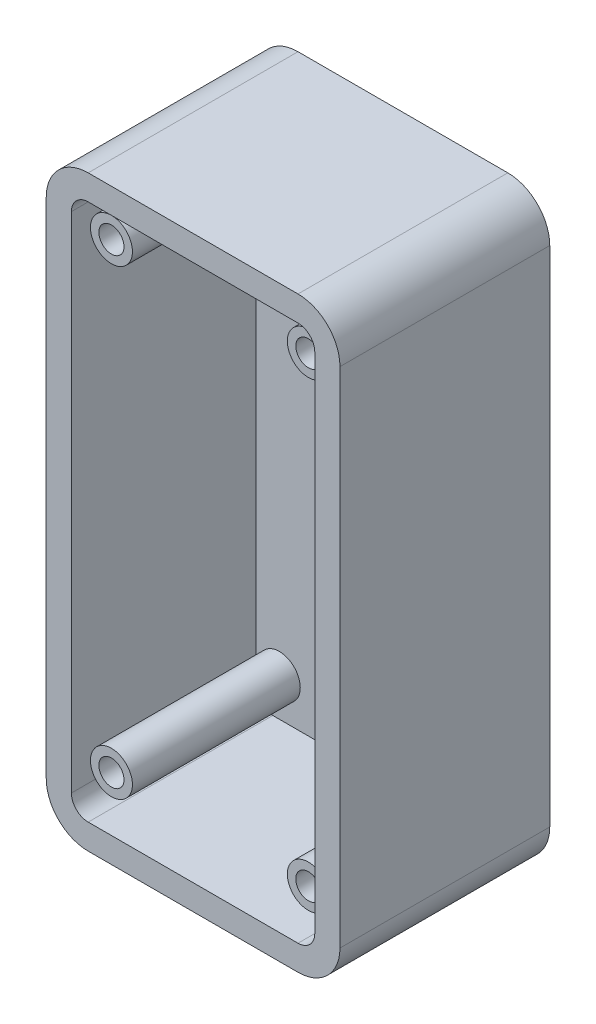
ISO-10303-21;
HEADER;
FILE_DESCRIPTION(('STEP AP214'),'2;1');
FILE_NAME('part.step','',(''),(''),'','','');
FILE_SCHEMA(('AUTOMOTIVE_DESIGN { 1 0 10303 214 1 1 1 1 }'));
ENDSEC;
DATA;
#1=APPLICATION_CONTEXT('core data for automotive mechanical design processes');
#2=APPLICATION_PROTOCOL_DEFINITION('international standard','automotive_design',2000,#1);
#3=PRODUCT_CONTEXT('',#1,'mechanical');
#4=PRODUCT('Part','Part','',(#3));
#5=PRODUCT_RELATED_PRODUCT_CATEGORY('part','',(#4));
#6=PRODUCT_DEFINITION_FORMATION('','',#4);
#7=PRODUCT_DEFINITION_CONTEXT('part definition',#1,'design');
#8=PRODUCT_DEFINITION('design','',#6,#7);
#9=PRODUCT_DEFINITION_SHAPE('','',#8);
#10=(LENGTH_UNIT() NAMED_UNIT(*) SI_UNIT(.MILLI.,.METRE.));
#11=(NAMED_UNIT(*) PLANE_ANGLE_UNIT() SI_UNIT($,.RADIAN.));
#12=(NAMED_UNIT(*) SI_UNIT($,.STERADIAN.) SOLID_ANGLE_UNIT());
#13=UNCERTAINTY_MEASURE_WITH_UNIT(LENGTH_MEASURE(1.E-05),#10,'distance_accuracy_value','');
#14=(GEOMETRIC_REPRESENTATION_CONTEXT(3) GLOBAL_UNCERTAINTY_ASSIGNED_CONTEXT((#13)) GLOBAL_UNIT_ASSIGNED_CONTEXT((#10,
#11,#12)) REPRESENTATION_CONTEXT('',''));
#15=CARTESIAN_POINT('',(0.,0.,0.));
#16=DIRECTION('',(0.,0.,1.));
#17=DIRECTION('',(1.,0.,0.));
#18=AXIS2_PLACEMENT_3D('',#15,#16,#17);
#19=CARTESIAN_POINT('',(-193.425196850394,5.,25.));
#20=DIRECTION('',(0.,0.,-1.));
#21=DIRECTION('',(-1.,0.,0.));
#22=AXIS2_PLACEMENT_3D('',#19,#20,#21);
#23=CYLINDRICAL_SURFACE('',#22,5.);
#24=CARTESIAN_POINT('',(-193.425196850394,5.,0.));
#25=DIRECTION('',(0.,0.,1.));
#26=DIRECTION('',(1.,0.,0.));
#27=AXIS2_PLACEMENT_3D('',#24,#25,#26);
#28=CIRCLE('',#27,5.);
#29=CARTESIAN_POINT('',(-198.425196850394,5.00000000000004,0.));
#30=VERTEX_POINT('',#29);
#31=CARTESIAN_POINT('',(-193.425196850394,0.,0.));
#32=VERTEX_POINT('',#31);
#33=EDGE_CURVE('E142',#30,#32,#28,.T.);
#34=ORIENTED_EDGE('',*,*,#33,.T.);
#35=DIRECTION('',(0.,0.,-1.));
#36=VECTOR('',#35,1.);
#37=CARTESIAN_POINT('',(-193.425196850394,0.,25.));
#38=LINE('',#37,#36);
#39=CARTESIAN_POINT('',(-193.425196850394,0.,25.));
#40=VERTEX_POINT('',#39);
#41=EDGE_CURVE('E11',#40,#32,#38,.T.);
#42=ORIENTED_EDGE('',*,*,#41,.F.);
#43=CARTESIAN_POINT('',(-193.425196850394,5.,25.));
#44=DIRECTION('',(0.,0.,1.));
#45=DIRECTION('',(1.,0.,0.));
#46=AXIS2_PLACEMENT_3D('',#43,#44,#45);
#47=CIRCLE('',#46,5.);
#48=CARTESIAN_POINT('',(-198.425196850394,5.00000000000004,25.));
#49=VERTEX_POINT('',#48);
#50=EDGE_CURVE('E158',#49,#40,#47,.T.);
#51=ORIENTED_EDGE('',*,*,#50,.F.);
#52=DIRECTION('',(0.,0.,-1.));
#53=VECTOR('',#52,1.);
#54=CARTESIAN_POINT('',(-198.425196850394,5.00000000000004,25.));
#55=LINE('',#54,#53);
#56=EDGE_CURVE('E138',#49,#30,#55,.T.);
#57=ORIENTED_EDGE('',*,*,#56,.T.);
#58=EDGE_LOOP('',(#34,#42,#51,#57));
#59=FACE_BOUND('',#58,.T.);
#60=ADVANCED_FACE('F33',(#59),#23,.T.);
#61=CARTESIAN_POINT('',(-193.425196850394,0.,25.));
#62=DIRECTION('',(0.,1.,0.));
#63=DIRECTION('',(0.,0.,1.));
#64=AXIS2_PLACEMENT_3D('',#61,#62,#63);
#65=PLANE('',#64);
#66=DIRECTION('',(1.,0.,0.));
#67=VECTOR('',#66,1.);
#68=CARTESIAN_POINT('',(-193.425196850394,0.,0.));
#69=LINE('',#68,#67);
#70=CARTESIAN_POINT('',(-168.425196850394,0.,0.));
#71=VERTEX_POINT('',#70);
#72=EDGE_CURVE('E145',#32,#71,#69,.T.);
#73=ORIENTED_EDGE('',*,*,#72,.T.);
#74=DIRECTION('',(0.,0.,-1.));
#75=VECTOR('',#74,1.);
#76=CARTESIAN_POINT('',(-168.425196850394,0.,25.));
#77=LINE('',#76,#75);
#78=CARTESIAN_POINT('',(-168.425196850394,0.,25.));
#79=VERTEX_POINT('',#78);
#80=EDGE_CURVE('E41',#79,#71,#77,.T.);
#81=ORIENTED_EDGE('',*,*,#80,.F.);
#82=DIRECTION('',(1.,0.,0.));
#83=VECTOR('',#82,1.);
#84=CARTESIAN_POINT('',(-193.425196850394,0.,25.));
#85=LINE('',#84,#83);
#86=EDGE_CURVE('E99',#40,#79,#85,.T.);
#87=ORIENTED_EDGE('',*,*,#86,.F.);
#88=ORIENTED_EDGE('',*,*,#41,.T.);
#89=EDGE_LOOP('',(#73,#81,#87,#88));
#90=FACE_BOUND('',#89,.T.);
#91=ADVANCED_FACE('F300',(#90),#65,.F.);
#92=CARTESIAN_POINT('',(-168.425196850394,5.,25.));
#93=DIRECTION('',(0.,0.,-1.));
#94=DIRECTION('',(-1.,0.,0.));
#95=AXIS2_PLACEMENT_3D('',#92,#93,#94);
#96=CYLINDRICAL_SURFACE('',#95,5.);
#97=CARTESIAN_POINT('',(-168.425196850394,5.,0.));
#98=DIRECTION('',(0.,0.,1.));
#99=DIRECTION('',(1.,0.,0.));
#100=AXIS2_PLACEMENT_3D('',#97,#98,#99);
#101=CIRCLE('',#100,5.);
#102=CARTESIAN_POINT('',(-163.425196850394,5.00000000000004,0.));
#103=VERTEX_POINT('',#102);
#104=EDGE_CURVE('E148',#71,#103,#101,.T.);
#105=ORIENTED_EDGE('',*,*,#104,.T.);
#106=DIRECTION('',(0.,0.,-1.));
#107=VECTOR('',#106,1.);
#108=CARTESIAN_POINT('',(-163.425196850394,5.00000000000004,25.));
#109=LINE('',#108,#107);
#110=CARTESIAN_POINT('',(-163.425196850394,5.00000000000004,25.));
#111=VERTEX_POINT('',#110);
#112=EDGE_CURVE('E165',#111,#103,#109,.T.);
#113=ORIENTED_EDGE('',*,*,#112,.F.);
#114=CARTESIAN_POINT('',(-168.425196850394,5.,25.));
#115=DIRECTION('',(0.,0.,1.));
#116=DIRECTION('',(1.,0.,0.));
#117=AXIS2_PLACEMENT_3D('',#114,#115,#116);
#118=CIRCLE('',#117,5.);
#119=EDGE_CURVE('E280',#79,#111,#118,.T.);
#120=ORIENTED_EDGE('',*,*,#119,.F.);
#121=ORIENTED_EDGE('',*,*,#80,.T.);
#122=EDGE_LOOP('',(#105,#113,#120,#121));
#123=FACE_BOUND('',#122,.T.);
#124=ADVANCED_FACE('F303',(#123),#96,.T.);
#125=CARTESIAN_POINT('',(-163.425196850394,65.,25.));
#126=DIRECTION('',(-1.,0.,0.));
#127=DIRECTION('',(0.,-1.,0.));
#128=AXIS2_PLACEMENT_3D('',#125,#126,#127);
#129=PLANE('',#128);
#130=DIRECTION('',(0.,1.,0.));
#131=VECTOR('',#130,1.);
#132=CARTESIAN_POINT('',(-163.425196850394,65.,0.));
#133=LINE('',#132,#131);
#134=CARTESIAN_POINT('',(-163.425196850394,65.,0.));
#135=VERTEX_POINT('',#134);
#136=EDGE_CURVE('E150',#103,#135,#133,.T.);
#137=ORIENTED_EDGE('',*,*,#136,.T.);
#138=DIRECTION('',(0.,0.,-1.));
#139=VECTOR('',#138,1.);
#140=CARTESIAN_POINT('',(-163.425196850394,65.,25.));
#141=LINE('',#140,#139);
#142=CARTESIAN_POINT('',(-163.425196850394,65.,25.));
#143=VERTEX_POINT('',#142);
#144=EDGE_CURVE('E162',#143,#135,#141,.T.);
#145=ORIENTED_EDGE('',*,*,#144,.F.);
#146=DIRECTION('',(0.,1.,0.));
#147=VECTOR('',#146,1.);
#148=CARTESIAN_POINT('',(-163.425196850394,65.,25.));
#149=LINE('',#148,#147);
#150=EDGE_CURVE('E282',#111,#143,#149,.T.);
#151=ORIENTED_EDGE('',*,*,#150,.F.);
#152=ORIENTED_EDGE('',*,*,#112,.T.);
#153=EDGE_LOOP('',(#137,#145,#151,#152));
#154=FACE_BOUND('',#153,.T.);
#155=ADVANCED_FACE('F288',(#154),#129,.F.);
#156=CARTESIAN_POINT('',(-168.425196850394,65.,25.));
#157=DIRECTION('',(0.,0.,-1.));
#158=DIRECTION('',(-1.,0.,0.));
#159=AXIS2_PLACEMENT_3D('',#156,#157,#158);
#160=CYLINDRICAL_SURFACE('',#159,5.);
#161=CARTESIAN_POINT('',(-168.425196850394,65.,0.));
#162=DIRECTION('',(0.,0.,1.));
#163=DIRECTION('',(-1.,0.,0.));
#164=AXIS2_PLACEMENT_3D('',#161,#162,#163);
#165=CIRCLE('',#164,5.);
#166=CARTESIAN_POINT('',(-168.425196850394,70.,0.));
#167=VERTEX_POINT('',#166);
#168=EDGE_CURVE('E152',#135,#167,#165,.T.);
#169=ORIENTED_EDGE('',*,*,#168,.T.);
#170=DIRECTION('',(0.,0.,-1.));
#171=VECTOR('',#170,1.);
#172=CARTESIAN_POINT('',(-168.425196850394,70.,25.));
#173=LINE('',#172,#171);
#174=CARTESIAN_POINT('',(-168.425196850394,70.,25.));
#175=VERTEX_POINT('',#174);
#176=EDGE_CURVE('E133',#175,#167,#173,.T.);
#177=ORIENTED_EDGE('',*,*,#176,.F.);
#178=CARTESIAN_POINT('',(-168.425196850394,65.,25.));
#179=DIRECTION('',(0.,0.,1.));
#180=DIRECTION('',(-1.,0.,0.));
#181=AXIS2_PLACEMENT_3D('',#178,#179,#180);
#182=CIRCLE('',#181,5.);
#183=EDGE_CURVE('E121',#143,#175,#182,.T.);
#184=ORIENTED_EDGE('',*,*,#183,.F.);
#185=ORIENTED_EDGE('',*,*,#144,.T.);
#186=EDGE_LOOP('',(#169,#177,#184,#185));
#187=FACE_BOUND('',#186,.T.);
#188=ADVANCED_FACE('F292',(#187),#160,.T.);
#189=CARTESIAN_POINT('',(-193.425196850394,70.,25.));
#190=DIRECTION('',(0.,-1.,0.));
#191=DIRECTION('',(0.,0.,-1.));
#192=AXIS2_PLACEMENT_3D('',#189,#190,#191);
#193=PLANE('',#192);
#194=DIRECTION('',(-1.,0.,0.));
#195=VECTOR('',#194,1.);
#196=CARTESIAN_POINT('',(-193.425196850394,70.,0.));
#197=LINE('',#196,#195);
#198=CARTESIAN_POINT('',(-193.425196850394,70.,0.));
#199=VERTEX_POINT('',#198);
#200=EDGE_CURVE('E130',#167,#199,#197,.T.);
#201=ORIENTED_EDGE('',*,*,#200,.T.);
#202=DIRECTION('',(0.,0.,-1.));
#203=VECTOR('',#202,1.);
#204=CARTESIAN_POINT('',(-193.425196850394,70.,25.));
#205=LINE('',#204,#203);
#206=CARTESIAN_POINT('',(-193.425196850394,70.,25.));
#207=VERTEX_POINT('',#206);
#208=EDGE_CURVE('E127',#207,#199,#205,.T.);
#209=ORIENTED_EDGE('',*,*,#208,.F.);
#210=DIRECTION('',(-1.,0.,0.));
#211=VECTOR('',#210,1.);
#212=CARTESIAN_POINT('',(-193.425196850394,70.,25.));
#213=LINE('',#212,#211);
#214=EDGE_CURVE('E114',#175,#207,#213,.T.);
#215=ORIENTED_EDGE('',*,*,#214,.F.);
#216=ORIENTED_EDGE('',*,*,#176,.T.);
#217=EDGE_LOOP('',(#201,#209,#215,#216));
#218=FACE_BOUND('',#217,.T.);
#219=ADVANCED_FACE('F128',(#218),#193,.F.);
#220=CARTESIAN_POINT('',(-193.425196850394,65.,25.));
#221=DIRECTION('',(0.,0.,-1.));
#222=DIRECTION('',(-1.,0.,0.));
#223=AXIS2_PLACEMENT_3D('',#220,#221,#222);
#224=CYLINDRICAL_SURFACE('',#223,5.);
#225=CARTESIAN_POINT('',(-193.425196850394,65.,0.));
#226=DIRECTION('',(0.,0.,1.));
#227=DIRECTION('',(1.,0.,0.));
#228=AXIS2_PLACEMENT_3D('',#225,#226,#227);
#229=CIRCLE('',#228,5.);
#230=CARTESIAN_POINT('',(-198.425196850394,65.,0.));
#231=VERTEX_POINT('',#230);
#232=EDGE_CURVE('E155',#199,#231,#229,.T.);
#233=ORIENTED_EDGE('',*,*,#232,.T.);
#234=DIRECTION('',(0.,0.,-1.));
#235=VECTOR('',#234,1.);
#236=CARTESIAN_POINT('',(-198.425196850394,65.,25.));
#237=LINE('',#236,#235);
#238=CARTESIAN_POINT('',(-198.425196850394,65.,25.));
#239=VERTEX_POINT('',#238);
#240=EDGE_CURVE('E134',#239,#231,#237,.T.);
#241=ORIENTED_EDGE('',*,*,#240,.F.);
#242=CARTESIAN_POINT('',(-193.425196850394,65.,25.));
#243=DIRECTION('',(0.,0.,1.));
#244=DIRECTION('',(1.,0.,0.));
#245=AXIS2_PLACEMENT_3D('',#242,#243,#244);
#246=CIRCLE('',#245,5.);
#247=EDGE_CURVE('E118',#207,#239,#246,.T.);
#248=ORIENTED_EDGE('',*,*,#247,.F.);
#249=ORIENTED_EDGE('',*,*,#208,.T.);
#250=EDGE_LOOP('',(#233,#241,#248,#249));
#251=FACE_BOUND('',#250,.T.);
#252=ADVANCED_FACE('F136',(#251),#224,.T.);
#253=CARTESIAN_POINT('',(-198.425196850394,65.,25.));
#254=DIRECTION('',(1.,0.,0.));
#255=DIRECTION('',(0.,0.,-1.));
#256=AXIS2_PLACEMENT_3D('',#253,#254,#255);
#257=PLANE('',#256);
#258=DIRECTION('',(0.,-1.,0.));
#259=VECTOR('',#258,1.);
#260=CARTESIAN_POINT('',(-198.425196850394,65.,0.));
#261=LINE('',#260,#259);
#262=EDGE_CURVE('E91',#231,#30,#261,.T.);
#263=ORIENTED_EDGE('',*,*,#262,.T.);
#264=ORIENTED_EDGE('',*,*,#56,.F.);
#265=DIRECTION('',(0.,-1.,0.));
#266=VECTOR('',#265,1.);
#267=CARTESIAN_POINT('',(-198.425196850394,65.,25.));
#268=LINE('',#267,#266);
#269=EDGE_CURVE('E58',#239,#49,#268,.T.);
#270=ORIENTED_EDGE('',*,*,#269,.F.);
#271=ORIENTED_EDGE('',*,*,#240,.T.);
#272=EDGE_LOOP('',(#263,#264,#270,#271));
#273=FACE_BOUND('',#272,.T.);
#274=ADVANCED_FACE('F296',(#273),#257,.F.);
#275=CARTESIAN_POINT('',(-193.425196850394,5.,25.));
#276=DIRECTION('',(0.,0.,1.));
#277=DIRECTION('',(1.,0.,0.));
#278=AXIS2_PLACEMENT_3D('',#275,#276,#277);
#279=PLANE('',#278);
#280=CARTESIAN_POINT('',(-193.425196850394,5.,25.));
#281=DIRECTION('',(0.,0.,1.));
#282=DIRECTION('',(1.,0.,0.));
#283=AXIS2_PLACEMENT_3D('',#280,#281,#282);
#284=CIRCLE('',#283,2.);
#285=CARTESIAN_POINT('',(-195.425196850394,5.00000000000003,25.));
#286=VERTEX_POINT('',#285);
#287=CARTESIAN_POINT('',(-193.425196850394,3.,25.));
#288=VERTEX_POINT('',#287);
#289=EDGE_CURVE('E257',#286,#288,#284,.T.);
#290=ORIENTED_EDGE('',*,*,#289,.F.);
#291=DIRECTION('',(0.,-1.,0.));
#292=VECTOR('',#291,1.);
#293=CARTESIAN_POINT('',(-195.425196850394,65.,25.));
#294=LINE('',#293,#292);
#295=CARTESIAN_POINT('',(-195.425196850394,65.,25.));
#296=VERTEX_POINT('',#295);
#297=EDGE_CURVE('E221',#296,#286,#294,.T.);
#298=ORIENTED_EDGE('',*,*,#297,.F.);
#299=CARTESIAN_POINT('',(-193.425196850394,65.,25.));
#300=DIRECTION('',(0.,0.,1.));
#301=DIRECTION('',(1.,0.,0.));
#302=AXIS2_PLACEMENT_3D('',#299,#300,#301);
#303=CIRCLE('',#302,2.);
#304=CARTESIAN_POINT('',(-193.425196850394,67.,25.));
#305=VERTEX_POINT('',#304);
#306=EDGE_CURVE('E275',#305,#296,#303,.T.);
#307=ORIENTED_EDGE('',*,*,#306,.F.);
#308=DIRECTION('',(-1.,0.,0.));
#309=VECTOR('',#308,1.);
#310=CARTESIAN_POINT('',(-193.425196850394,67.,25.));
#311=LINE('',#310,#309);
#312=CARTESIAN_POINT('',(-168.425196850394,67.,25.));
#313=VERTEX_POINT('',#312);
#314=EDGE_CURVE('E272',#313,#305,#311,.T.);
#315=ORIENTED_EDGE('',*,*,#314,.F.);
#316=CARTESIAN_POINT('',(-168.425196850394,65.,25.));
#317=DIRECTION('',(0.,0.,1.));
#318=DIRECTION('',(1.,0.,0.));
#319=AXIS2_PLACEMENT_3D('',#316,#317,#318);
#320=CIRCLE('',#319,2.);
#321=CARTESIAN_POINT('',(-166.425196850394,65.,25.));
#322=VERTEX_POINT('',#321);
#323=EDGE_CURVE('E269',#322,#313,#320,.T.);
#324=ORIENTED_EDGE('',*,*,#323,.F.);
#325=DIRECTION('',(0.,1.,0.));
#326=VECTOR('',#325,1.);
#327=CARTESIAN_POINT('',(-166.425196850394,65.,25.));
#328=LINE('',#327,#326);
#329=CARTESIAN_POINT('',(-166.425196850394,5.00000000000001,25.));
#330=VERTEX_POINT('',#329);
#331=EDGE_CURVE('E266',#330,#322,#328,.T.);
#332=ORIENTED_EDGE('',*,*,#331,.F.);
#333=CARTESIAN_POINT('',(-168.425196850394,5.,25.));
#334=DIRECTION('',(0.,0.,1.));
#335=DIRECTION('',(1.,0.,0.));
#336=AXIS2_PLACEMENT_3D('',#333,#334,#335);
#337=CIRCLE('',#336,2.);
#338=CARTESIAN_POINT('',(-168.425196850394,3.,25.));
#339=VERTEX_POINT('',#338);
#340=EDGE_CURVE('E263',#339,#330,#337,.T.);
#341=ORIENTED_EDGE('',*,*,#340,.F.);
#342=DIRECTION('',(1.,0.,0.));
#343=VECTOR('',#342,1.);
#344=CARTESIAN_POINT('',(-193.425196850394,3.,25.));
#345=LINE('',#344,#343);
#346=EDGE_CURVE('E260',#288,#339,#345,.T.);
#347=ORIENTED_EDGE('',*,*,#346,.F.);
#348=EDGE_LOOP('',(#290,#298,#307,#315,#324,#332,#341,#347));
#349=FACE_BOUND('',#348,.T.);
#350=ORIENTED_EDGE('',*,*,#50,.T.);
#351=ORIENTED_EDGE('',*,*,#86,.T.);
#352=ORIENTED_EDGE('',*,*,#119,.T.);
#353=ORIENTED_EDGE('',*,*,#150,.T.);
#354=ORIENTED_EDGE('',*,*,#183,.T.);
#355=ORIENTED_EDGE('',*,*,#214,.T.);
#356=ORIENTED_EDGE('',*,*,#247,.T.);
#357=ORIENTED_EDGE('',*,*,#269,.T.);
#358=EDGE_LOOP('',(#350,#351,#352,#353,#354,#355,#356,#357));
#359=FACE_BOUND('',#358,.T.);
#360=ADVANCED_FACE('F116',(#349,#359),#279,.T.);
#361=CARTESIAN_POINT('',(-193.425196850394,5.,0.));
#362=DIRECTION('',(0.,0.,1.));
#363=DIRECTION('',(1.,0.,0.));
#364=AXIS2_PLACEMENT_3D('',#361,#362,#363);
#365=PLANE('',#364);
#366=CARTESIAN_POINT('',(-192.65673945571,7.5,0.));
#367=DIRECTION('',(0.,0.,1.));
#368=DIRECTION('',(1.,0.,0.));
#369=AXIS2_PLACEMENT_3D('',#366,#367,#368);
#370=CIRCLE('',#369,1.5);
#371=CARTESIAN_POINT('',(-191.15673945571,7.5,0.));
#372=VERTEX_POINT('',#371);
#373=EDGE_CURVE('E598',#372,#372,#370,.T.);
#374=ORIENTED_EDGE('',*,*,#373,.T.);
#375=EDGE_LOOP('',(#374));
#376=FACE_BOUND('',#375,.T.);
#377=CARTESIAN_POINT('',(-169.193654245077,7.5,0.));
#378=DIRECTION('',(0.,0.,1.));
#379=DIRECTION('',(1.,0.,0.));
#380=AXIS2_PLACEMENT_3D('',#377,#378,#379);
#381=CIRCLE('',#380,1.5);
#382=CARTESIAN_POINT('',(-167.693654245077,7.5,0.));
#383=VERTEX_POINT('',#382);
#384=EDGE_CURVE('E595',#383,#383,#381,.T.);
#385=ORIENTED_EDGE('',*,*,#384,.T.);
#386=EDGE_LOOP('',(#385));
#387=FACE_BOUND('',#386,.T.);
#388=CARTESIAN_POINT('',(-169.193654245077,62.5,0.));
#389=DIRECTION('',(0.,0.,1.));
#390=DIRECTION('',(1.,0.,0.));
#391=AXIS2_PLACEMENT_3D('',#388,#389,#390);
#392=CIRCLE('',#391,1.5);
#393=CARTESIAN_POINT('',(-167.693654245077,62.5,0.));
#394=VERTEX_POINT('',#393);
#395=EDGE_CURVE('E593',#394,#394,#392,.T.);
#396=ORIENTED_EDGE('',*,*,#395,.T.);
#397=EDGE_LOOP('',(#396));
#398=FACE_BOUND('',#397,.T.);
#399=CARTESIAN_POINT('',(-192.65673945571,62.5,0.));
#400=DIRECTION('',(0.,0.,1.));
#401=DIRECTION('',(1.,0.,0.));
#402=AXIS2_PLACEMENT_3D('',#399,#400,#401);
#403=CIRCLE('',#402,1.5);
#404=CARTESIAN_POINT('',(-191.15673945571,62.5,0.));
#405=VERTEX_POINT('',#404);
#406=EDGE_CURVE('E174',#405,#405,#403,.T.);
#407=ORIENTED_EDGE('',*,*,#406,.T.);
#408=EDGE_LOOP('',(#407));
#409=FACE_BOUND('',#408,.T.);
#410=ORIENTED_EDGE('',*,*,#33,.F.);
#411=ORIENTED_EDGE('',*,*,#262,.F.);
#412=ORIENTED_EDGE('',*,*,#232,.F.);
#413=ORIENTED_EDGE('',*,*,#200,.F.);
#414=ORIENTED_EDGE('',*,*,#168,.F.);
#415=ORIENTED_EDGE('',*,*,#136,.F.);
#416=ORIENTED_EDGE('',*,*,#104,.F.);
#417=ORIENTED_EDGE('',*,*,#72,.F.);
#418=EDGE_LOOP('',(#410,#411,#412,#413,#414,#415,#416,#417));
#419=FACE_BOUND('',#418,.T.);
#420=ADVANCED_FACE('F295',(#376,#387,#398,#409,#419),#365,.F.);
#421=CARTESIAN_POINT('',(-193.425196850394,5.,25.));
#422=DIRECTION('',(0.,0.,-1.));
#423=DIRECTION('',(-1.,0.,0.));
#424=AXIS2_PLACEMENT_3D('',#421,#422,#423);
#425=CYLINDRICAL_SURFACE('',#424,2.);
#426=CARTESIAN_POINT('',(-193.425196850394,5.,3.));
#427=DIRECTION('',(0.,0.,1.));
#428=DIRECTION('',(1.,0.,0.));
#429=AXIS2_PLACEMENT_3D('',#426,#427,#428);
#430=CIRCLE('',#429,2.);
#431=CARTESIAN_POINT('',(-195.425196850394,5.00000000000001,3.));
#432=VERTEX_POINT('',#431);
#433=CARTESIAN_POINT('',(-193.425196850394,3.,3.));
#434=VERTEX_POINT('',#433);
#435=EDGE_CURVE('E209',#432,#434,#430,.T.);
#436=ORIENTED_EDGE('',*,*,#435,.F.);
#437=DIRECTION('',(0.,0.,-1.));
#438=VECTOR('',#437,1.);
#439=CARTESIAN_POINT('',(-195.425196850394,5.00000000000001,25.));
#440=LINE('',#439,#438);
#441=EDGE_CURVE('E218',#286,#432,#440,.T.);
#442=ORIENTED_EDGE('',*,*,#441,.F.);
#443=ORIENTED_EDGE('',*,*,#289,.T.);
#444=DIRECTION('',(0.,0.,1.));
#445=VECTOR('',#444,1.);
#446=CARTESIAN_POINT('',(-193.425196850394,3.,25.));
#447=LINE('',#446,#445);
#448=EDGE_CURVE('E146',#288,#434,#447,.F.);
#449=ORIENTED_EDGE('',*,*,#448,.T.);
#450=EDGE_LOOP('',(#436,#442,#443,#449));
#451=FACE_BOUND('',#450,.T.);
#452=ADVANCED_FACE('F376',(#451),#425,.F.);
#453=CARTESIAN_POINT('',(-193.425196850394,3.,25.));
#454=DIRECTION('',(0.,1.,0.));
#455=DIRECTION('',(0.,0.,1.));
#456=AXIS2_PLACEMENT_3D('',#453,#454,#455);
#457=PLANE('',#456);
#458=DIRECTION('',(1.,0.,0.));
#459=VECTOR('',#458,1.);
#460=CARTESIAN_POINT('',(-193.425196850394,3.,3.));
#461=LINE('',#460,#459);
#462=CARTESIAN_POINT('',(-168.425196850394,3.,3.));
#463=VERTEX_POINT('',#462);
#464=EDGE_CURVE('E214',#434,#463,#461,.T.);
#465=ORIENTED_EDGE('',*,*,#464,.F.);
#466=ORIENTED_EDGE('',*,*,#448,.F.);
#467=ORIENTED_EDGE('',*,*,#346,.T.);
#468=DIRECTION('',(0.,0.,-1.));
#469=VECTOR('',#468,1.);
#470=CARTESIAN_POINT('',(-168.425196850394,3.,25.));
#471=LINE('',#470,#469);
#472=EDGE_CURVE('E217',#339,#463,#471,.T.);
#473=ORIENTED_EDGE('',*,*,#472,.T.);
#474=EDGE_LOOP('',(#465,#466,#467,#473));
#475=FACE_BOUND('',#474,.T.);
#476=ADVANCED_FACE('F381',(#475),#457,.T.);
#477=CARTESIAN_POINT('',(-168.425196850394,5.,25.));
#478=DIRECTION('',(0.,0.,-1.));
#479=DIRECTION('',(-1.,0.,0.));
#480=AXIS2_PLACEMENT_3D('',#477,#478,#479);
#481=CYLINDRICAL_SURFACE('',#480,2.);
#482=CARTESIAN_POINT('',(-168.425196850394,5.,3.));
#483=DIRECTION('',(0.,0.,1.));
#484=DIRECTION('',(1.,0.,0.));
#485=AXIS2_PLACEMENT_3D('',#482,#483,#484);
#486=CIRCLE('',#485,2.);
#487=CARTESIAN_POINT('',(-166.425196850394,5.00000000000003,3.));
#488=VERTEX_POINT('',#487);
#489=EDGE_CURVE('E224',#463,#488,#486,.T.);
#490=ORIENTED_EDGE('',*,*,#489,.F.);
#491=ORIENTED_EDGE('',*,*,#472,.F.);
#492=ORIENTED_EDGE('',*,*,#340,.T.);
#493=DIRECTION('',(0.,0.,1.));
#494=VECTOR('',#493,1.);
#495=CARTESIAN_POINT('',(-166.425196850394,5.00000000000003,25.));
#496=LINE('',#495,#494);
#497=EDGE_CURVE('E227',#330,#488,#496,.F.);
#498=ORIENTED_EDGE('',*,*,#497,.T.);
#499=EDGE_LOOP('',(#490,#491,#492,#498));
#500=FACE_BOUND('',#499,.T.);
#501=ADVANCED_FACE('F391',(#500),#481,.F.);
#502=CARTESIAN_POINT('',(-166.425196850394,65.,25.));
#503=DIRECTION('',(-1.,0.,0.));
#504=DIRECTION('',(0.,-1.,0.));
#505=AXIS2_PLACEMENT_3D('',#502,#503,#504);
#506=PLANE('',#505);
#507=DIRECTION('',(0.,1.,0.));
#508=VECTOR('',#507,1.);
#509=CARTESIAN_POINT('',(-166.425196850394,65.,3.));
#510=LINE('',#509,#508);
#511=CARTESIAN_POINT('',(-166.425196850394,65.,3.));
#512=VERTEX_POINT('',#511);
#513=EDGE_CURVE('E230',#488,#512,#510,.T.);
#514=ORIENTED_EDGE('',*,*,#513,.F.);
#515=ORIENTED_EDGE('',*,*,#497,.F.);
#516=ORIENTED_EDGE('',*,*,#331,.T.);
#517=DIRECTION('',(0.,0.,-1.));
#518=VECTOR('',#517,1.);
#519=CARTESIAN_POINT('',(-166.425196850394,65.,25.));
#520=LINE('',#519,#518);
#521=EDGE_CURVE('E233',#322,#512,#520,.T.);
#522=ORIENTED_EDGE('',*,*,#521,.T.);
#523=EDGE_LOOP('',(#514,#515,#516,#522));
#524=FACE_BOUND('',#523,.T.);
#525=ADVANCED_FACE('F401',(#524),#506,.T.);
#526=CARTESIAN_POINT('',(-168.425196850394,65.,25.));
#527=DIRECTION('',(0.,0.,-1.));
#528=DIRECTION('',(-1.,0.,0.));
#529=AXIS2_PLACEMENT_3D('',#526,#527,#528);
#530=CYLINDRICAL_SURFACE('',#529,2.);
#531=CARTESIAN_POINT('',(-168.425196850394,65.,3.));
#532=DIRECTION('',(0.,0.,1.));
#533=DIRECTION('',(1.,0.,0.));
#534=AXIS2_PLACEMENT_3D('',#531,#532,#533);
#535=CIRCLE('',#534,2.);
#536=CARTESIAN_POINT('',(-168.425196850394,67.,3.));
#537=VERTEX_POINT('',#536);
#538=EDGE_CURVE('E236',#512,#537,#535,.T.);
#539=ORIENTED_EDGE('',*,*,#538,.F.);
#540=ORIENTED_EDGE('',*,*,#521,.F.);
#541=ORIENTED_EDGE('',*,*,#323,.T.);
#542=DIRECTION('',(0.,0.,-1.));
#543=VECTOR('',#542,1.);
#544=CARTESIAN_POINT('',(-168.425196850394,67.,25.));
#545=LINE('',#544,#543);
#546=EDGE_CURVE('E239',#313,#537,#545,.T.);
#547=ORIENTED_EDGE('',*,*,#546,.T.);
#548=EDGE_LOOP('',(#539,#540,#541,#547));
#549=FACE_BOUND('',#548,.T.);
#550=ADVANCED_FACE('F411',(#549),#530,.F.);
#551=CARTESIAN_POINT('',(-193.425196850394,67.,25.));
#552=DIRECTION('',(0.,-1.,0.));
#553=DIRECTION('',(0.,0.,-1.));
#554=AXIS2_PLACEMENT_3D('',#551,#552,#553);
#555=PLANE('',#554);
#556=DIRECTION('',(-1.,0.,0.));
#557=VECTOR('',#556,1.);
#558=CARTESIAN_POINT('',(-193.425196850394,67.,3.));
#559=LINE('',#558,#557);
#560=CARTESIAN_POINT('',(-193.425196850394,67.,3.));
#561=VERTEX_POINT('',#560);
#562=EDGE_CURVE('E242',#537,#561,#559,.T.);
#563=ORIENTED_EDGE('',*,*,#562,.F.);
#564=ORIENTED_EDGE('',*,*,#546,.F.);
#565=ORIENTED_EDGE('',*,*,#314,.T.);
#566=DIRECTION('',(0.,0.,-1.));
#567=VECTOR('',#566,1.);
#568=CARTESIAN_POINT('',(-193.425196850394,67.,25.));
#569=LINE('',#568,#567);
#570=EDGE_CURVE('E245',#305,#561,#569,.T.);
#571=ORIENTED_EDGE('',*,*,#570,.T.);
#572=EDGE_LOOP('',(#563,#564,#565,#571));
#573=FACE_BOUND('',#572,.T.);
#574=ADVANCED_FACE('F421',(#573),#555,.T.);
#575=CARTESIAN_POINT('',(-193.425196850394,65.,25.));
#576=DIRECTION('',(0.,0.,-1.));
#577=DIRECTION('',(-1.,0.,0.));
#578=AXIS2_PLACEMENT_3D('',#575,#576,#577);
#579=CYLINDRICAL_SURFACE('',#578,2.);
#580=CARTESIAN_POINT('',(-193.425196850394,65.,3.));
#581=DIRECTION('',(0.,0.,1.));
#582=DIRECTION('',(1.,0.,0.));
#583=AXIS2_PLACEMENT_3D('',#580,#581,#582);
#584=CIRCLE('',#583,2.);
#585=CARTESIAN_POINT('',(-195.425196850394,65.,3.));
#586=VERTEX_POINT('',#585);
#587=EDGE_CURVE('E248',#561,#586,#584,.T.);
#588=ORIENTED_EDGE('',*,*,#587,.F.);
#589=ORIENTED_EDGE('',*,*,#570,.F.);
#590=ORIENTED_EDGE('',*,*,#306,.T.);
#591=DIRECTION('',(0.,0.,-1.));
#592=VECTOR('',#591,1.);
#593=CARTESIAN_POINT('',(-195.425196850394,65.,25.));
#594=LINE('',#593,#592);
#595=EDGE_CURVE('E49',#296,#586,#594,.T.);
#596=ORIENTED_EDGE('',*,*,#595,.T.);
#597=EDGE_LOOP('',(#588,#589,#590,#596));
#598=FACE_BOUND('',#597,.T.);
#599=ADVANCED_FACE('F431',(#598),#579,.F.);
#600=CARTESIAN_POINT('',(-195.425196850394,65.,25.));
#601=DIRECTION('',(1.,0.,0.));
#602=DIRECTION('',(0.,0.,-1.));
#603=AXIS2_PLACEMENT_3D('',#600,#601,#602);
#604=PLANE('',#603);
#605=DIRECTION('',(0.,-1.,0.));
#606=VECTOR('',#605,1.);
#607=CARTESIAN_POINT('',(-195.425196850394,65.,3.));
#608=LINE('',#607,#606);
#609=EDGE_CURVE('E253',#586,#432,#608,.T.);
#610=ORIENTED_EDGE('',*,*,#609,.F.);
#611=ORIENTED_EDGE('',*,*,#595,.F.);
#612=ORIENTED_EDGE('',*,*,#297,.T.);
#613=ORIENTED_EDGE('',*,*,#441,.T.);
#614=EDGE_LOOP('',(#610,#611,#612,#613));
#615=FACE_BOUND('',#614,.T.);
#616=ADVANCED_FACE('F441',(#615),#604,.T.);
#617=CARTESIAN_POINT('',(-193.425196850394,5.,3.));
#618=DIRECTION('',(0.,0.,1.));
#619=DIRECTION('',(1.,0.,0.));
#620=AXIS2_PLACEMENT_3D('',#617,#618,#619);
#621=PLANE('',#620);
#622=CARTESIAN_POINT('',(-169.193654245077,7.5,3.));
#623=DIRECTION('',(0.,0.,1.));
#624=DIRECTION('',(1.,0.,0.));
#625=AXIS2_PLACEMENT_3D('',#622,#623,#624);
#626=CIRCLE('',#625,2.5);
#627=CARTESIAN_POINT('',(-166.693654245077,7.5,3.));
#628=VERTEX_POINT('',#627);
#629=EDGE_CURVE('E181',#628,#628,#626,.T.);
#630=ORIENTED_EDGE('',*,*,#629,.F.);
#631=EDGE_LOOP('',(#630));
#632=FACE_BOUND('',#631,.T.);
#633=CARTESIAN_POINT('',(-169.193654245077,62.5,3.));
#634=DIRECTION('',(0.,0.,1.));
#635=DIRECTION('',(1.,0.,0.));
#636=AXIS2_PLACEMENT_3D('',#633,#634,#635);
#637=CIRCLE('',#636,2.5);
#638=CARTESIAN_POINT('',(-166.693654245077,62.5,3.));
#639=VERTEX_POINT('',#638);
#640=EDGE_CURVE('E190',#639,#639,#637,.T.);
#641=ORIENTED_EDGE('',*,*,#640,.F.);
#642=EDGE_LOOP('',(#641));
#643=FACE_BOUND('',#642,.T.);
#644=CARTESIAN_POINT('',(-192.65673945571,7.5,3.));
#645=DIRECTION('',(0.,0.,1.));
#646=DIRECTION('',(1.,0.,0.));
#647=AXIS2_PLACEMENT_3D('',#644,#645,#646);
#648=CIRCLE('',#647,2.5);
#649=CARTESIAN_POINT('',(-190.15673945571,7.5,3.));
#650=VERTEX_POINT('',#649);
#651=EDGE_CURVE('E197',#650,#650,#648,.T.);
#652=ORIENTED_EDGE('',*,*,#651,.F.);
#653=EDGE_LOOP('',(#652));
#654=FACE_BOUND('',#653,.T.);
#655=CARTESIAN_POINT('',(-192.65673945571,62.5,3.));
#656=DIRECTION('',(0.,0.,1.));
#657=DIRECTION('',(1.,0.,0.));
#658=AXIS2_PLACEMENT_3D('',#655,#656,#657);
#659=CIRCLE('',#658,2.5);
#660=CARTESIAN_POINT('',(-190.15673945571,62.5,3.));
#661=VERTEX_POINT('',#660);
#662=EDGE_CURVE('E203',#661,#661,#659,.T.);
#663=ORIENTED_EDGE('',*,*,#662,.F.);
#664=EDGE_LOOP('',(#663));
#665=FACE_BOUND('',#664,.T.);
#666=ORIENTED_EDGE('',*,*,#435,.T.);
#667=ORIENTED_EDGE('',*,*,#464,.T.);
#668=ORIENTED_EDGE('',*,*,#489,.T.);
#669=ORIENTED_EDGE('',*,*,#513,.T.);
#670=ORIENTED_EDGE('',*,*,#538,.T.);
#671=ORIENTED_EDGE('',*,*,#562,.T.);
#672=ORIENTED_EDGE('',*,*,#587,.T.);
#673=ORIENTED_EDGE('',*,*,#609,.T.);
#674=EDGE_LOOP('',(#666,#667,#668,#669,#670,#671,#672,#673));
#675=FACE_BOUND('',#674,.T.);
#676=ADVANCED_FACE('F451',(#632,#643,#654,#665,#675),#621,.T.);
#677=CARTESIAN_POINT('',(-192.65673945571,62.5,23.));
#678=DIRECTION('',(0.,0.,-1.));
#679=DIRECTION('',(-1.,0.,0.));
#680=AXIS2_PLACEMENT_3D('',#677,#678,#679);
#681=CYLINDRICAL_SURFACE('',#680,2.5);
#682=CARTESIAN_POINT('',(-192.65673945571,62.5,23.));
#683=DIRECTION('',(0.,0.,1.));
#684=DIRECTION('',(1.,0.,0.));
#685=AXIS2_PLACEMENT_3D('',#682,#683,#684);
#686=CIRCLE('',#685,2.5);
#687=CARTESIAN_POINT('',(-190.15673945571,62.5,23.));
#688=VERTEX_POINT('',#687);
#689=EDGE_CURVE('E206',#688,#688,#686,.T.);
#690=ORIENTED_EDGE('',*,*,#689,.F.);
#691=EDGE_LOOP('',(#690));
#692=FACE_BOUND('',#691,.T.);
#693=ORIENTED_EDGE('',*,*,#662,.T.);
#694=EDGE_LOOP('',(#693));
#695=FACE_BOUND('',#694,.T.);
#696=ADVANCED_FACE('F460',(#692,#695),#681,.T.);
#697=CARTESIAN_POINT('',(-192.65673945571,62.5,23.));
#698=DIRECTION('',(0.,0.,1.));
#699=DIRECTION('',(1.,0.,0.));
#700=AXIS2_PLACEMENT_3D('',#697,#698,#699);
#701=PLANE('',#700);
#702=CARTESIAN_POINT('',(-192.65673945571,62.5,23.));
#703=DIRECTION('',(0.,0.,1.));
#704=DIRECTION('',(1.,0.,0.));
#705=AXIS2_PLACEMENT_3D('',#702,#703,#704);
#706=CIRCLE('',#705,1.5);
#707=CARTESIAN_POINT('',(-191.15673945571,62.5,23.));
#708=VERTEX_POINT('',#707);
#709=EDGE_CURVE('E36',#708,#708,#706,.T.);
#710=ORIENTED_EDGE('',*,*,#709,.F.);
#711=EDGE_LOOP('',(#710));
#712=FACE_BOUND('',#711,.T.);
#713=ORIENTED_EDGE('',*,*,#689,.T.);
#714=EDGE_LOOP('',(#713));
#715=FACE_BOUND('',#714,.T.);
#716=ADVANCED_FACE('F470',(#712,#715),#701,.T.);
#717=CARTESIAN_POINT('',(-192.65673945571,7.5,23.));
#718=DIRECTION('',(0.,0.,-1.));
#719=DIRECTION('',(-1.,0.,0.));
#720=AXIS2_PLACEMENT_3D('',#717,#718,#719);
#721=CYLINDRICAL_SURFACE('',#720,2.5);
#722=CARTESIAN_POINT('',(-192.65673945571,7.5,23.));
#723=DIRECTION('',(0.,0.,1.));
#724=DIRECTION('',(1.,0.,0.));
#725=AXIS2_PLACEMENT_3D('',#722,#723,#724);
#726=CIRCLE('',#725,2.5);
#727=CARTESIAN_POINT('',(-190.15673945571,7.5,23.));
#728=VERTEX_POINT('',#727);
#729=EDGE_CURVE('E200',#728,#728,#726,.T.);
#730=ORIENTED_EDGE('',*,*,#729,.F.);
#731=EDGE_LOOP('',(#730));
#732=FACE_BOUND('',#731,.T.);
#733=ORIENTED_EDGE('',*,*,#651,.T.);
#734=EDGE_LOOP('',(#733));
#735=FACE_BOUND('',#734,.T.);
#736=ADVANCED_FACE('F478',(#732,#735),#721,.T.);
#737=CARTESIAN_POINT('',(-192.65673945571,7.5,23.));
#738=DIRECTION('',(0.,0.,1.));
#739=DIRECTION('',(1.,0.,0.));
#740=AXIS2_PLACEMENT_3D('',#737,#738,#739);
#741=PLANE('',#740);
#742=CARTESIAN_POINT('',(-192.65673945571,7.5,23.));
#743=DIRECTION('',(0.,0.,1.));
#744=DIRECTION('',(1.,0.,0.));
#745=AXIS2_PLACEMENT_3D('',#742,#743,#744);
#746=CIRCLE('',#745,1.5);
#747=CARTESIAN_POINT('',(-191.15673945571,7.5,23.));
#748=VERTEX_POINT('',#747);
#749=EDGE_CURVE('E176',#748,#748,#746,.T.);
#750=ORIENTED_EDGE('',*,*,#749,.F.);
#751=EDGE_LOOP('',(#750));
#752=FACE_BOUND('',#751,.T.);
#753=ORIENTED_EDGE('',*,*,#729,.T.);
#754=EDGE_LOOP('',(#753));
#755=FACE_BOUND('',#754,.T.);
#756=ADVANCED_FACE('F483',(#752,#755),#741,.T.);
#757=CARTESIAN_POINT('',(-169.193654245077,62.5,23.));
#758=DIRECTION('',(0.,0.,-1.));
#759=DIRECTION('',(-1.,0.,0.));
#760=AXIS2_PLACEMENT_3D('',#757,#758,#759);
#761=CYLINDRICAL_SURFACE('',#760,2.5);
#762=CARTESIAN_POINT('',(-169.193654245077,62.5,23.));
#763=DIRECTION('',(0.,0.,1.));
#764=DIRECTION('',(1.,0.,0.));
#765=AXIS2_PLACEMENT_3D('',#762,#763,#764);
#766=CIRCLE('',#765,2.5);
#767=CARTESIAN_POINT('',(-166.693654245077,62.5,23.));
#768=VERTEX_POINT('',#767);
#769=EDGE_CURVE('E194',#768,#768,#766,.T.);
#770=ORIENTED_EDGE('',*,*,#769,.F.);
#771=EDGE_LOOP('',(#770));
#772=FACE_BOUND('',#771,.T.);
#773=ORIENTED_EDGE('',*,*,#640,.T.);
#774=EDGE_LOOP('',(#773));
#775=FACE_BOUND('',#774,.T.);
#776=ADVANCED_FACE('F491',(#772,#775),#761,.T.);
#777=CARTESIAN_POINT('',(-169.193654245077,62.5,23.));
#778=DIRECTION('',(0.,0.,1.));
#779=DIRECTION('',(1.,0.,0.));
#780=AXIS2_PLACEMENT_3D('',#777,#778,#779);
#781=PLANE('',#780);
#782=CARTESIAN_POINT('',(-169.193654245077,62.5,23.));
#783=DIRECTION('',(0.,0.,1.));
#784=DIRECTION('',(1.,0.,0.));
#785=AXIS2_PLACEMENT_3D('',#782,#783,#784);
#786=CIRCLE('',#785,1.5);
#787=CARTESIAN_POINT('',(-167.693654245077,62.5,23.));
#788=VERTEX_POINT('',#787);
#789=EDGE_CURVE('E173',#788,#788,#786,.T.);
#790=ORIENTED_EDGE('',*,*,#789,.F.);
#791=EDGE_LOOP('',(#790));
#792=FACE_BOUND('',#791,.T.);
#793=ORIENTED_EDGE('',*,*,#769,.T.);
#794=EDGE_LOOP('',(#793));
#795=FACE_BOUND('',#794,.T.);
#796=ADVANCED_FACE('F496',(#792,#795),#781,.T.);
#797=CARTESIAN_POINT('',(-169.193654245077,7.5,23.));
#798=DIRECTION('',(0.,0.,-1.));
#799=DIRECTION('',(-1.,0.,0.));
#800=AXIS2_PLACEMENT_3D('',#797,#798,#799);
#801=CYLINDRICAL_SURFACE('',#800,2.5);
#802=CARTESIAN_POINT('',(-169.193654245077,7.5,23.));
#803=DIRECTION('',(0.,0.,1.));
#804=DIRECTION('',(1.,0.,0.));
#805=AXIS2_PLACEMENT_3D('',#802,#803,#804);
#806=CIRCLE('',#805,2.5);
#807=CARTESIAN_POINT('',(-166.693654245077,7.5,23.));
#808=VERTEX_POINT('',#807);
#809=EDGE_CURVE('E185',#808,#808,#806,.T.);
#810=ORIENTED_EDGE('',*,*,#809,.F.);
#811=EDGE_LOOP('',(#810));
#812=FACE_BOUND('',#811,.T.);
#813=ORIENTED_EDGE('',*,*,#629,.T.);
#814=EDGE_LOOP('',(#813));
#815=FACE_BOUND('',#814,.T.);
#816=ADVANCED_FACE('F504',(#812,#815),#801,.T.);
#817=CARTESIAN_POINT('',(-169.193654245077,7.5,23.));
#818=DIRECTION('',(0.,0.,1.));
#819=DIRECTION('',(1.,0.,0.));
#820=AXIS2_PLACEMENT_3D('',#817,#818,#819);
#821=PLANE('',#820);
#822=CARTESIAN_POINT('',(-169.193654245077,7.5,23.));
#823=DIRECTION('',(0.,0.,1.));
#824=DIRECTION('',(1.,0.,0.));
#825=AXIS2_PLACEMENT_3D('',#822,#823,#824);
#826=CIRCLE('',#825,1.5);
#827=CARTESIAN_POINT('',(-167.693654245077,7.5,23.));
#828=VERTEX_POINT('',#827);
#829=EDGE_CURVE('E170',#828,#828,#826,.T.);
#830=ORIENTED_EDGE('',*,*,#829,.F.);
#831=EDGE_LOOP('',(#830));
#832=FACE_BOUND('',#831,.T.);
#833=ORIENTED_EDGE('',*,*,#809,.T.);
#834=EDGE_LOOP('',(#833));
#835=FACE_BOUND('',#834,.T.);
#836=ADVANCED_FACE('F509',(#832,#835),#821,.T.);
#837=CARTESIAN_POINT('',(-169.193654245077,7.5,0.));
#838=DIRECTION('',(0.,0.,1.));
#839=DIRECTION('',(1.,0.,0.));
#840=AXIS2_PLACEMENT_3D('',#837,#838,#839);
#841=CYLINDRICAL_SURFACE('',#840,1.5);
#842=ORIENTED_EDGE('',*,*,#829,.T.);
#843=EDGE_LOOP('',(#842));
#844=FACE_BOUND('',#843,.T.);
#845=ORIENTED_EDGE('',*,*,#384,.F.);
#846=EDGE_LOOP('',(#845));
#847=FACE_BOUND('',#846,.T.);
#848=ADVANCED_FACE('F547',(#844,#847),#841,.F.);
#849=CARTESIAN_POINT('',(-169.193654245077,62.5,0.));
#850=DIRECTION('',(0.,0.,1.));
#851=DIRECTION('',(1.,0.,0.));
#852=AXIS2_PLACEMENT_3D('',#849,#850,#851);
#853=CYLINDRICAL_SURFACE('',#852,1.5);
#854=ORIENTED_EDGE('',*,*,#789,.T.);
#855=EDGE_LOOP('',(#854));
#856=FACE_BOUND('',#855,.T.);
#857=ORIENTED_EDGE('',*,*,#395,.F.);
#858=EDGE_LOOP('',(#857));
#859=FACE_BOUND('',#858,.T.);
#860=ADVANCED_FACE('F557',(#856,#859),#853,.F.);
#861=CARTESIAN_POINT('',(-192.65673945571,7.5,0.));
#862=DIRECTION('',(0.,0.,1.));
#863=DIRECTION('',(1.,0.,0.));
#864=AXIS2_PLACEMENT_3D('',#861,#862,#863);
#865=CYLINDRICAL_SURFACE('',#864,1.5);
#866=ORIENTED_EDGE('',*,*,#749,.T.);
#867=EDGE_LOOP('',(#866));
#868=FACE_BOUND('',#867,.T.);
#869=ORIENTED_EDGE('',*,*,#373,.F.);
#870=EDGE_LOOP('',(#869));
#871=FACE_BOUND('',#870,.T.);
#872=ADVANCED_FACE('F567',(#868,#871),#865,.F.);
#873=CARTESIAN_POINT('',(-192.65673945571,62.5,0.));
#874=DIRECTION('',(0.,0.,1.));
#875=DIRECTION('',(1.,0.,0.));
#876=AXIS2_PLACEMENT_3D('',#873,#874,#875);
#877=CYLINDRICAL_SURFACE('',#876,1.5);
#878=ORIENTED_EDGE('',*,*,#709,.T.);
#879=EDGE_LOOP('',(#878));
#880=FACE_BOUND('',#879,.T.);
#881=ORIENTED_EDGE('',*,*,#406,.F.);
#882=EDGE_LOOP('',(#881));
#883=FACE_BOUND('',#882,.T.);
#884=ADVANCED_FACE('F577',(#880,#883),#877,.F.);
#885=CLOSED_SHELL('',(#60,#91,#124,#155,#188,#219,#252,#274,#360,#420,#452,#476,#501,#525,#550,
#574,#599,#616,#676,#696,#716,#736,#756,#776,#796,#816,#836,#848,#860,#872,#884));
#886=MANIFOLD_SOLID_BREP('B2',#885);
#887=ADVANCED_BREP_SHAPE_REPRESENTATION('',(#18,#886),#14);
#888=SHAPE_DEFINITION_REPRESENTATION(#9,#887);
ENDSEC;
END-ISO-10303-21;
